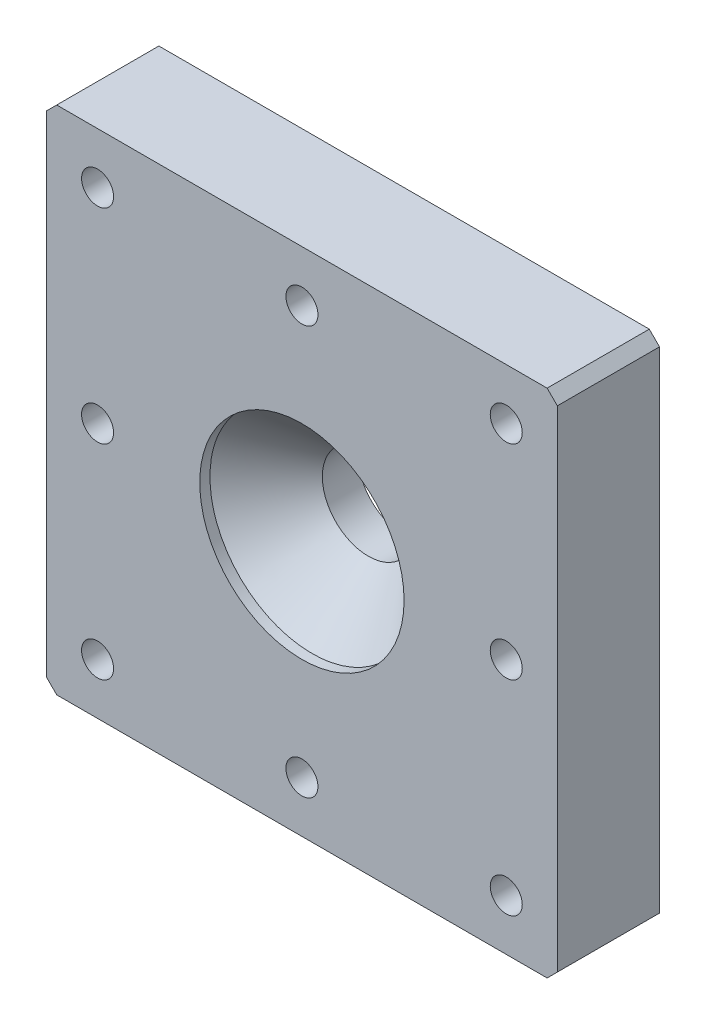
ISO-10303-21;
HEADER;
FILE_DESCRIPTION(('STEP AP214'),'2;1');
FILE_NAME('part.step','',(''),(''),'','','');
FILE_SCHEMA(('AUTOMOTIVE_DESIGN { 1 0 10303 214 1 1 1 1 }'));
ENDSEC;
DATA;
#1=APPLICATION_CONTEXT('core data for automotive mechanical design processes');
#2=APPLICATION_PROTOCOL_DEFINITION('international standard','automotive_design',2000,#1);
#3=PRODUCT_CONTEXT('',#1,'mechanical');
#4=PRODUCT('Part','Part','',(#3));
#5=PRODUCT_RELATED_PRODUCT_CATEGORY('part','',(#4));
#6=PRODUCT_DEFINITION_FORMATION('','',#4);
#7=PRODUCT_DEFINITION_CONTEXT('part definition',#1,'design');
#8=PRODUCT_DEFINITION('design','',#6,#7);
#9=PRODUCT_DEFINITION_SHAPE('','',#8);
#10=(LENGTH_UNIT() NAMED_UNIT(*) SI_UNIT(.MILLI.,.METRE.));
#11=(NAMED_UNIT(*) PLANE_ANGLE_UNIT() SI_UNIT($,.RADIAN.));
#12=(NAMED_UNIT(*) SI_UNIT($,.STERADIAN.) SOLID_ANGLE_UNIT());
#13=UNCERTAINTY_MEASURE_WITH_UNIT(LENGTH_MEASURE(1.E-05),#10,'distance_accuracy_value','');
#14=(GEOMETRIC_REPRESENTATION_CONTEXT(3) GLOBAL_UNCERTAINTY_ASSIGNED_CONTEXT((#13)) GLOBAL_UNIT_ASSIGNED_CONTEXT((#10,
#11,#12)) REPRESENTATION_CONTEXT('',''));
#15=CARTESIAN_POINT('',(0.,0.,0.));
#16=DIRECTION('',(0.,0.,1.));
#17=DIRECTION('',(1.,0.,0.));
#18=AXIS2_PLACEMENT_3D('',#15,#16,#17);
#19=CARTESIAN_POINT('',(0.,0.,5.));
#20=DIRECTION('',(0.,0.,1.));
#21=DIRECTION('',(1.,0.,0.));
#22=AXIS2_PLACEMENT_3D('',#19,#20,#21);
#23=PLANE('',#22);
#24=CARTESIAN_POINT('',(0.,0.,5.));
#25=DIRECTION('',(0.,0.,-1.));
#26=DIRECTION('',(-1.,0.,0.));
#27=AXIS2_PLACEMENT_3D('',#24,#25,#26);
#28=CIRCLE('',#27,5.);
#29=CARTESIAN_POINT('',(5.,0.,5.));
#30=VERTEX_POINT('',#29);
#31=EDGE_CURVE('E23',#30,#30,#28,.T.);
#32=ORIENTED_EDGE('',*,*,#31,.T.);
#33=EDGE_LOOP('',(#32));
#34=FACE_BOUND('',#33,.T.);
#35=CARTESIAN_POINT('',(10.,0.,5.));
#36=DIRECTION('',(0.,0.,-1.));
#37=DIRECTION('',(1.,0.,0.));
#38=AXIS2_PLACEMENT_3D('',#35,#36,#37);
#39=CIRCLE('',#38,0.7835);
#40=CARTESIAN_POINT('',(10.7835,0.,5.));
#41=VERTEX_POINT('',#40);
#42=EDGE_CURVE('E165',#41,#41,#39,.T.);
#43=ORIENTED_EDGE('',*,*,#42,.T.);
#44=EDGE_LOOP('',(#43));
#45=FACE_BOUND('',#44,.T.);
#46=CARTESIAN_POINT('',(10.,-10.,5.));
#47=DIRECTION('',(0.,0.,-1.));
#48=DIRECTION('',(1.,0.,0.));
#49=AXIS2_PLACEMENT_3D('',#46,#47,#48);
#50=CIRCLE('',#49,0.7835);
#51=CARTESIAN_POINT('',(10.7835,-10.,5.));
#52=VERTEX_POINT('',#51);
#53=EDGE_CURVE('E170',#52,#52,#50,.T.);
#54=ORIENTED_EDGE('',*,*,#53,.T.);
#55=EDGE_LOOP('',(#54));
#56=FACE_BOUND('',#55,.T.);
#57=CARTESIAN_POINT('',(0.,-10.,5.));
#58=DIRECTION('',(0.,0.,-1.));
#59=DIRECTION('',(1.,0.,0.));
#60=AXIS2_PLACEMENT_3D('',#57,#58,#59);
#61=CIRCLE('',#60,0.7835);
#62=CARTESIAN_POINT('',(0.7835,-10.,5.));
#63=VERTEX_POINT('',#62);
#64=EDGE_CURVE('E178',#63,#63,#61,.T.);
#65=ORIENTED_EDGE('',*,*,#64,.T.);
#66=EDGE_LOOP('',(#65));
#67=FACE_BOUND('',#66,.T.);
#68=CARTESIAN_POINT('',(-10.,-10.,5.));
#69=DIRECTION('',(0.,0.,-1.));
#70=DIRECTION('',(1.,0.,0.));
#71=AXIS2_PLACEMENT_3D('',#68,#69,#70);
#72=CIRCLE('',#71,0.7835);
#73=CARTESIAN_POINT('',(-9.2165,-10.,5.));
#74=VERTEX_POINT('',#73);
#75=EDGE_CURVE('E207',#74,#74,#72,.T.);
#76=ORIENTED_EDGE('',*,*,#75,.T.);
#77=EDGE_LOOP('',(#76));
#78=FACE_BOUND('',#77,.T.);
#79=CARTESIAN_POINT('',(-10.,0.,5.));
#80=DIRECTION('',(0.,0.,-1.));
#81=DIRECTION('',(1.,0.,0.));
#82=AXIS2_PLACEMENT_3D('',#79,#80,#81);
#83=CIRCLE('',#82,0.7835);
#84=CARTESIAN_POINT('',(-9.2165,0.,5.));
#85=VERTEX_POINT('',#84);
#86=EDGE_CURVE('E212',#85,#85,#83,.T.);
#87=ORIENTED_EDGE('',*,*,#86,.T.);
#88=EDGE_LOOP('',(#87));
#89=FACE_BOUND('',#88,.T.);
#90=CARTESIAN_POINT('',(10.,10.,5.));
#91=DIRECTION('',(0.,0.,-1.));
#92=DIRECTION('',(1.,0.,0.));
#93=AXIS2_PLACEMENT_3D('',#90,#91,#92);
#94=CIRCLE('',#93,0.7835);
#95=CARTESIAN_POINT('',(10.7835,10.,5.));
#96=VERTEX_POINT('',#95);
#97=EDGE_CURVE('E216',#96,#96,#94,.T.);
#98=ORIENTED_EDGE('',*,*,#97,.T.);
#99=EDGE_LOOP('',(#98));
#100=FACE_BOUND('',#99,.T.);
#101=CARTESIAN_POINT('',(0.,10.,5.));
#102=DIRECTION('',(0.,0.,-1.));
#103=DIRECTION('',(1.,0.,0.));
#104=AXIS2_PLACEMENT_3D('',#101,#102,#103);
#105=CIRCLE('',#104,0.7835);
#106=CARTESIAN_POINT('',(0.7835,10.,5.));
#107=VERTEX_POINT('',#106);
#108=EDGE_CURVE('E220',#107,#107,#105,.T.);
#109=ORIENTED_EDGE('',*,*,#108,.T.);
#110=EDGE_LOOP('',(#109));
#111=FACE_BOUND('',#110,.T.);
#112=CARTESIAN_POINT('',(-10.,10.,5.));
#113=DIRECTION('',(0.,0.,-1.));
#114=DIRECTION('',(1.,0.,0.));
#115=AXIS2_PLACEMENT_3D('',#112,#113,#114);
#116=CIRCLE('',#115,0.7835);
#117=CARTESIAN_POINT('',(-9.2165,10.,5.));
#118=VERTEX_POINT('',#117);
#119=EDGE_CURVE('E226',#118,#118,#116,.T.);
#120=ORIENTED_EDGE('',*,*,#119,.T.);
#121=EDGE_LOOP('',(#120));
#122=FACE_BOUND('',#121,.T.);
#123=DIRECTION('',(-0.707106781186549,-0.707106781186546,0.));
#124=VECTOR('',#123,1.);
#125=CARTESIAN_POINT('',(12.5,-12.,5.));
#126=LINE('',#125,#124);
#127=CARTESIAN_POINT('',(12.5,-12.,5.));
#128=VERTEX_POINT('',#127);
#129=CARTESIAN_POINT('',(12.,-12.5,5.));
#130=VERTEX_POINT('',#129);
#131=EDGE_CURVE('E425',#128,#130,#126,.T.);
#132=ORIENTED_EDGE('',*,*,#131,.F.);
#133=DIRECTION('',(0.,-1.,0.));
#134=VECTOR('',#133,1.);
#135=CARTESIAN_POINT('',(12.5,12.,5.));
#136=LINE('',#135,#134);
#137=CARTESIAN_POINT('',(12.5,12.,5.));
#138=VERTEX_POINT('',#137);
#139=EDGE_CURVE('E385',#138,#128,#136,.T.);
#140=ORIENTED_EDGE('',*,*,#139,.F.);
#141=DIRECTION('',(0.707106781186546,-0.707106781186549,0.));
#142=VECTOR('',#141,1.);
#143=CARTESIAN_POINT('',(12.,12.5,5.));
#144=LINE('',#143,#142);
#145=CARTESIAN_POINT('',(12.,12.5,5.));
#146=VERTEX_POINT('',#145);
#147=EDGE_CURVE('E244',#146,#138,#144,.T.);
#148=ORIENTED_EDGE('',*,*,#147,.F.);
#149=DIRECTION('',(1.,0.,0.));
#150=VECTOR('',#149,1.);
#151=CARTESIAN_POINT('',(-12.,12.5,5.));
#152=LINE('',#151,#150);
#153=CARTESIAN_POINT('',(-12.,12.5,5.));
#154=VERTEX_POINT('',#153);
#155=EDGE_CURVE('E258',#154,#146,#152,.T.);
#156=ORIENTED_EDGE('',*,*,#155,.F.);
#157=DIRECTION('',(0.707106781186549,0.707106781186546,0.));
#158=VECTOR('',#157,1.);
#159=CARTESIAN_POINT('',(-12.5,12.,5.));
#160=LINE('',#159,#158);
#161=CARTESIAN_POINT('',(-12.5,12.,5.));
#162=VERTEX_POINT('',#161);
#163=EDGE_CURVE('E278',#162,#154,#160,.T.);
#164=ORIENTED_EDGE('',*,*,#163,.F.);
#165=DIRECTION('',(0.,1.,0.));
#166=VECTOR('',#165,1.);
#167=CARTESIAN_POINT('',(-12.5,-12.,5.));
#168=LINE('',#167,#166);
#169=CARTESIAN_POINT('',(-12.5,-12.,5.));
#170=VERTEX_POINT('',#169);
#171=EDGE_CURVE('E230',#170,#162,#168,.T.);
#172=ORIENTED_EDGE('',*,*,#171,.F.);
#173=DIRECTION('',(-0.707106781186546,0.707106781186549,0.));
#174=VECTOR('',#173,1.);
#175=CARTESIAN_POINT('',(-12.,-12.5,5.));
#176=LINE('',#175,#174);
#177=CARTESIAN_POINT('',(-12.,-12.5,5.));
#178=VERTEX_POINT('',#177);
#179=EDGE_CURVE('E238',#178,#170,#176,.T.);
#180=ORIENTED_EDGE('',*,*,#179,.F.);
#181=DIRECTION('',(-1.,0.,0.));
#182=VECTOR('',#181,1.);
#183=CARTESIAN_POINT('',(12.,-12.5,5.));
#184=LINE('',#183,#182);
#185=EDGE_CURVE('E10',#130,#178,#184,.T.);
#186=ORIENTED_EDGE('',*,*,#185,.F.);
#187=EDGE_LOOP('',(#132,#140,#148,#156,#164,#172,#180,#186));
#188=FACE_BOUND('',#187,.T.);
#189=ADVANCED_FACE('F15',(#34,#45,#56,#67,#78,#89,#100,#111,#122,#188),#23,.T.);
#190=CARTESIAN_POINT('',(12.5,-12.5,0.));
#191=DIRECTION('',(0.,-1.,0.));
#192=DIRECTION('',(0.,0.,-1.));
#193=AXIS2_PLACEMENT_3D('',#190,#191,#192);
#194=PLANE('',#193);
#195=DIRECTION('',(0.,0.,-1.));
#196=VECTOR('',#195,1.);
#197=CARTESIAN_POINT('',(12.,-12.5,5.));
#198=LINE('',#197,#196);
#199=CARTESIAN_POINT('',(12.,-12.5,0.));
#200=VERTEX_POINT('',#199);
#201=EDGE_CURVE('E420',#130,#200,#198,.T.);
#202=ORIENTED_EDGE('',*,*,#201,.F.);
#203=ORIENTED_EDGE('',*,*,#185,.T.);
#204=DIRECTION('',(0.,0.,1.));
#205=VECTOR('',#204,1.);
#206=CARTESIAN_POINT('',(-12.,-12.5,0.));
#207=LINE('',#206,#205);
#208=CARTESIAN_POINT('',(-12.,-12.5,0.));
#209=VERTEX_POINT('',#208);
#210=EDGE_CURVE('E234',#209,#178,#207,.T.);
#211=ORIENTED_EDGE('',*,*,#210,.F.);
#212=DIRECTION('',(-1.,0.,0.));
#213=VECTOR('',#212,1.);
#214=CARTESIAN_POINT('',(12.,-12.5,0.));
#215=LINE('',#214,#213);
#216=EDGE_CURVE('E374',#200,#209,#215,.T.);
#217=ORIENTED_EDGE('',*,*,#216,.F.);
#218=EDGE_LOOP('',(#202,#203,#211,#217));
#219=FACE_BOUND('',#218,.T.);
#220=ADVANCED_FACE('F476',(#219),#194,.T.);
#221=CARTESIAN_POINT('',(0.,0.,5.));
#222=DIRECTION('',(0.,0.,-1.));
#223=DIRECTION('',(-1.,0.,0.));
#224=AXIS2_PLACEMENT_3D('',#221,#222,#223);
#225=CYLINDRICAL_SURFACE('',#224,5.);
#226=ORIENTED_EDGE('',*,*,#31,.F.);
#227=EDGE_LOOP('',(#226));
#228=FACE_BOUND('',#227,.T.);
#229=CARTESIAN_POINT('',(0.,0.,4.5));
#230=DIRECTION('',(0.,0.,1.));
#231=DIRECTION('',(-1.,0.,0.));
#232=AXIS2_PLACEMENT_3D('',#229,#230,#231);
#233=CIRCLE('',#232,5.);
#234=CARTESIAN_POINT('',(5.,0.,4.5));
#235=VERTEX_POINT('',#234);
#236=EDGE_CURVE('E169',#235,#235,#233,.T.);
#237=ORIENTED_EDGE('',*,*,#236,.F.);
#238=EDGE_LOOP('',(#237));
#239=FACE_BOUND('',#238,.T.);
#240=ADVANCED_FACE('F478',(#228,#239),#225,.F.);
#241=CARTESIAN_POINT('',(-2.25,0.,1.75));
#242=CARTESIAN_POINT('',(-2.25,-2.25,1.75));
#243=CARTESIAN_POINT('',(0.,-2.25,1.75));
#244=CARTESIAN_POINT('',(2.25,-2.25,1.75));
#245=CARTESIAN_POINT('',(2.25,0.,1.75));
#246=CARTESIAN_POINT('',(2.25,2.25,1.75));
#247=CARTESIAN_POINT('',(0.,2.25,1.75));
#248=CARTESIAN_POINT('',(-2.25,2.25,1.75));
#249=CARTESIAN_POINT('',(-2.25,0.,1.75));
#250=CARTESIAN_POINT('',(-2.25,0.,0.));
#251=CARTESIAN_POINT('',(-2.25,-2.25,0.));
#252=CARTESIAN_POINT('',(0.,-2.25,0.));
#253=CARTESIAN_POINT('',(2.25,-2.25,0.));
#254=CARTESIAN_POINT('',(2.25,0.,0.));
#255=CARTESIAN_POINT('',(2.25,2.25,0.));
#256=CARTESIAN_POINT('',(0.,2.25,0.));
#257=CARTESIAN_POINT('',(-2.25,2.25,0.));
#258=CARTESIAN_POINT('',(-2.25,0.,0.));
#259=(BOUNDED_SURFACE() B_SPLINE_SURFACE(1,2,((#241,#242,#243,#244,#245,#246,#247,#248,#249),
(#250,#251,#252,#253,#254,#255,#256,#257,#258)),.UNSPECIFIED.,.F.,.T.,
.F.) B_SPLINE_SURFACE_WITH_KNOTS((2,2),(3,2,2,2,3),(-14.6476187300952,-13.8698409523174),(0.,
3.53429173528852,7.06858347057704,10.6028752058655,14.1371669411541),
.UNSPECIFIED.) GEOMETRIC_REPRESENTATION_ITEM() RATIONAL_B_SPLINE_SURFACE(((1.,0.707106781186548,
1.,0.707106781186548,1.,0.707106781186548,1.,0.707106781186548,1.),(1.,0.707106781186548,1.,
0.707106781186548,1.,0.707106781186548,1.,0.707106781186548,1.))) REPRESENTATION_ITEM('') SURFACE());
#260=CARTESIAN_POINT('',(0.,0.,1.75));
#261=DIRECTION('',(0.,0.,1.));
#262=DIRECTION('',(1.,0.,0.));
#263=AXIS2_PLACEMENT_3D('',#260,#261,#262);
#264=CIRCLE('',#263,2.25);
#265=CARTESIAN_POINT('',(2.25,0.,1.75));
#266=VERTEX_POINT('',#265);
#267=EDGE_CURVE('E42',#266,#266,#264,.T.);
#268=CARTESIAN_POINT('',(0.,0.,0.));
#269=DIRECTION('',(0.,0.,1.));
#270=DIRECTION('',(1.,0.,0.));
#271=AXIS2_PLACEMENT_3D('',#268,#269,#270);
#272=CIRCLE('',#271,2.25);
#273=CARTESIAN_POINT('',(-2.25,0.,0.));
#274=VERTEX_POINT('',#273);
#275=EDGE_CURVE('E285',#274,#274,#272,.T.);
#276=ORIENTED_EDGE('',*,*,#267,.T.);
#277=EDGE_LOOP('',(#276));
#278=FACE_BOUND('',#277,.T.);
#279=ORIENTED_EDGE('',*,*,#275,.F.);
#280=EDGE_LOOP('',(#279));
#281=FACE_BOUND('',#280,.T.);
#282=ADVANCED_FACE('F484',(#278,#281),#259,.F.);
#283=CARTESIAN_POINT('',(-5.,0.,4.5));
#284=CARTESIAN_POINT('',(-5.,-5.,4.5));
#285=CARTESIAN_POINT('',(0.,-5.,4.5));
#286=CARTESIAN_POINT('',(5.,-5.,4.5));
#287=CARTESIAN_POINT('',(5.,0.,4.5));
#288=CARTESIAN_POINT('',(5.,5.,4.5));
#289=CARTESIAN_POINT('',(0.,5.,4.5));
#290=CARTESIAN_POINT('',(-5.,5.,4.5));
#291=CARTESIAN_POINT('',(-5.,0.,4.5));
#292=CARTESIAN_POINT('',(-2.25,0.,1.75));
#293=CARTESIAN_POINT('',(-2.25,-2.25,1.75));
#294=CARTESIAN_POINT('',(0.,-2.25,1.75));
#295=CARTESIAN_POINT('',(2.25,-2.25,1.75));
#296=CARTESIAN_POINT('',(2.25,0.,1.75));
#297=CARTESIAN_POINT('',(2.25,2.25,1.75));
#298=CARTESIAN_POINT('',(0.,2.25,1.75));
#299=CARTESIAN_POINT('',(-2.25,2.25,1.75));
#300=CARTESIAN_POINT('',(-2.25,0.,1.75));
#301=(BOUNDED_SURFACE() B_SPLINE_SURFACE(1,2,((#283,#284,#285,#286,#287,#288,#289,#290,#291),
(#292,#293,#294,#295,#296,#297,#298,#299,#300)),.UNSPECIFIED.,.F.,.T.,
.F.) B_SPLINE_SURFACE_WITH_KNOTS((2,2),(3,2,2,2,3),(-0.536425834003588,0.536425834003587),(0.,
5.6941366846315,11.388273369263,17.0824100538945,22.776546738526),
.UNSPECIFIED.) GEOMETRIC_REPRESENTATION_ITEM() RATIONAL_B_SPLINE_SURFACE(((1.,0.707106781186548,
1.,0.707106781186548,1.,0.707106781186548,1.,0.707106781186548,1.),(1.,0.707106781186548,1.,
0.707106781186548,1.,0.707106781186548,1.,0.707106781186548,1.))) REPRESENTATION_ITEM('') SURFACE());
#302=ORIENTED_EDGE('',*,*,#267,.F.);
#303=EDGE_LOOP('',(#302));
#304=FACE_BOUND('',#303,.T.);
#305=ORIENTED_EDGE('',*,*,#236,.T.);
#306=EDGE_LOOP('',(#305));
#307=FACE_BOUND('',#306,.T.);
#308=ADVANCED_FACE('F492',(#304,#307),#301,.F.);
#309=CARTESIAN_POINT('',(9.2165,0.,5.));
#310=CARTESIAN_POINT('',(9.2165,-0.783499999999999,5.));
#311=CARTESIAN_POINT('',(10.,-0.7835,5.));
#312=CARTESIAN_POINT('',(10.7835,-0.783499999999999,5.));
#313=CARTESIAN_POINT('',(10.7835,0.,5.));
#314=CARTESIAN_POINT('',(10.7835,0.783499999999999,5.));
#315=CARTESIAN_POINT('',(10.,0.7835,5.));
#316=CARTESIAN_POINT('',(9.2165,0.783499999999999,5.));
#317=CARTESIAN_POINT('',(9.2165,0.,5.));
#318=CARTESIAN_POINT('',(9.2165,0.,0.));
#319=CARTESIAN_POINT('',(9.2165,-0.783499999999999,0.));
#320=CARTESIAN_POINT('',(10.,-0.7835,0.));
#321=CARTESIAN_POINT('',(10.7835,-0.783499999999999,0.));
#322=CARTESIAN_POINT('',(10.7835,0.,0.));
#323=CARTESIAN_POINT('',(10.7835,0.783499999999999,0.));
#324=CARTESIAN_POINT('',(10.,0.7835,0.));
#325=CARTESIAN_POINT('',(9.2165,0.783499999999999,0.));
#326=CARTESIAN_POINT('',(9.2165,0.,0.));
#327=(BOUNDED_SURFACE() B_SPLINE_SURFACE(1,2,((#309,#310,#311,#312,#313,#314,#315,#316,#317),
(#318,#319,#320,#321,#322,#323,#324,#325,#326)),.UNSPECIFIED.,.F.,.T.,
.F.) B_SPLINE_SURFACE_WITH_KNOTS((2,2),(3,2,2,2,3),(-45.5738891419454,-39.1922682102288),(0.,
1.2307189220438,2.4614378440876,3.69215676613141,4.92287568817521),
.UNSPECIFIED.) GEOMETRIC_REPRESENTATION_ITEM() RATIONAL_B_SPLINE_SURFACE(((1.,0.707106781186548,
1.,0.707106781186548,1.,0.707106781186548,1.,0.707106781186548,1.),(1.,0.707106781186548,1.,
0.707106781186548,1.,0.707106781186548,1.,0.707106781186548,1.))) REPRESENTATION_ITEM('') SURFACE());
#328=CARTESIAN_POINT('',(10.,0.,0.));
#329=DIRECTION('',(0.,0.,1.));
#330=DIRECTION('',(1.,0.,0.));
#331=AXIS2_PLACEMENT_3D('',#328,#329,#330);
#332=CIRCLE('',#331,0.7835);
#333=CARTESIAN_POINT('',(9.2165,0.,0.));
#334=VERTEX_POINT('',#333);
#335=EDGE_CURVE('E291',#334,#334,#332,.T.);
#336=ORIENTED_EDGE('',*,*,#42,.F.);
#337=EDGE_LOOP('',(#336));
#338=FACE_BOUND('',#337,.T.);
#339=ORIENTED_EDGE('',*,*,#335,.F.);
#340=EDGE_LOOP('',(#339));
#341=FACE_BOUND('',#340,.T.);
#342=ADVANCED_FACE('F515',(#338,#341),#327,.F.);
#343=CARTESIAN_POINT('',(9.2165,-10.,5.));
#344=CARTESIAN_POINT('',(9.2165,-10.7835,5.));
#345=CARTESIAN_POINT('',(10.,-10.7835,5.));
#346=CARTESIAN_POINT('',(10.7835,-10.7835,5.));
#347=CARTESIAN_POINT('',(10.7835,-10.,5.));
#348=CARTESIAN_POINT('',(10.7835,-9.2165,5.));
#349=CARTESIAN_POINT('',(10.,-9.2165,5.));
#350=CARTESIAN_POINT('',(9.2165,-9.2165,5.));
#351=CARTESIAN_POINT('',(9.2165,-10.,5.));
#352=CARTESIAN_POINT('',(9.2165,-10.,0.));
#353=CARTESIAN_POINT('',(9.2165,-10.7835,0.));
#354=CARTESIAN_POINT('',(10.,-10.7835,0.));
#355=CARTESIAN_POINT('',(10.7835,-10.7835,0.));
#356=CARTESIAN_POINT('',(10.7835,-10.,0.));
#357=CARTESIAN_POINT('',(10.7835,-9.2165,0.));
#358=CARTESIAN_POINT('',(10.,-9.2165,0.));
#359=CARTESIAN_POINT('',(9.2165,-9.2165,0.));
#360=CARTESIAN_POINT('',(9.2165,-10.,0.));
#361=(BOUNDED_SURFACE() B_SPLINE_SURFACE(1,2,((#343,#344,#345,#346,#347,#348,#349,#350,#351),
(#352,#353,#354,#355,#356,#357,#358,#359,#360)),.UNSPECIFIED.,.F.,.T.,
.F.) B_SPLINE_SURFACE_WITH_KNOTS((2,2),(3,2,2,2,3),(-45.5738891419454,-39.1922682102288),(0.,
1.2307189220438,2.4614378440876,3.69215676613141,4.92287568817521),
.UNSPECIFIED.) GEOMETRIC_REPRESENTATION_ITEM() RATIONAL_B_SPLINE_SURFACE(((1.,0.707106781186548,
1.,0.707106781186548,1.,0.707106781186548,1.,0.707106781186548,1.),(1.,0.707106781186548,1.,
0.707106781186548,1.,0.707106781186548,1.,0.707106781186548,1.))) REPRESENTATION_ITEM('') SURFACE());
#362=CARTESIAN_POINT('',(10.,-10.,0.));
#363=DIRECTION('',(0.,0.,1.));
#364=DIRECTION('',(1.,0.,0.));
#365=AXIS2_PLACEMENT_3D('',#362,#363,#364);
#366=CIRCLE('',#365,0.7835);
#367=CARTESIAN_POINT('',(9.2165,-10.,0.));
#368=VERTEX_POINT('',#367);
#369=EDGE_CURVE('E297',#368,#368,#366,.T.);
#370=ORIENTED_EDGE('',*,*,#53,.F.);
#371=EDGE_LOOP('',(#370));
#372=FACE_BOUND('',#371,.T.);
#373=ORIENTED_EDGE('',*,*,#369,.F.);
#374=EDGE_LOOP('',(#373));
#375=FACE_BOUND('',#374,.T.);
#376=ADVANCED_FACE('F504',(#372,#375),#361,.F.);
#377=CARTESIAN_POINT('',(-0.7835,-10.,5.));
#378=CARTESIAN_POINT('',(-0.783499999999999,-10.7835,5.));
#379=CARTESIAN_POINT('',(0.,-10.7835,5.));
#380=CARTESIAN_POINT('',(0.783499999999999,-10.7835,5.));
#381=CARTESIAN_POINT('',(0.7835,-10.,5.));
#382=CARTESIAN_POINT('',(0.783499999999999,-9.2165,5.));
#383=CARTESIAN_POINT('',(0.,-9.2165,5.));
#384=CARTESIAN_POINT('',(-0.783499999999999,-9.2165,5.));
#385=CARTESIAN_POINT('',(-0.7835,-10.,5.));
#386=CARTESIAN_POINT('',(-0.7835,-10.,0.));
#387=CARTESIAN_POINT('',(-0.783499999999999,-10.7835,0.));
#388=CARTESIAN_POINT('',(0.,-10.7835,0.));
#389=CARTESIAN_POINT('',(0.783499999999999,-10.7835,0.));
#390=CARTESIAN_POINT('',(0.7835,-10.,0.));
#391=CARTESIAN_POINT('',(0.783499999999999,-9.2165,0.));
#392=CARTESIAN_POINT('',(0.,-9.2165,0.));
#393=CARTESIAN_POINT('',(-0.783499999999999,-9.2165,0.));
#394=CARTESIAN_POINT('',(-0.7835,-10.,0.));
#395=(BOUNDED_SURFACE() B_SPLINE_SURFACE(1,2,((#377,#378,#379,#380,#381,#382,#383,#384,#385),
(#386,#387,#388,#389,#390,#391,#392,#393,#394)),.UNSPECIFIED.,.F.,.T.,
.F.) B_SPLINE_SURFACE_WITH_KNOTS((2,2),(3,2,2,2,3),(-45.5738891419454,-39.1922682102288),(0.,
1.2307189220438,2.4614378440876,3.69215676613141,4.92287568817521),
.UNSPECIFIED.) GEOMETRIC_REPRESENTATION_ITEM() RATIONAL_B_SPLINE_SURFACE(((1.,0.707106781186548,
1.,0.707106781186548,1.,0.707106781186548,1.,0.707106781186548,1.),(1.,0.707106781186548,1.,
0.707106781186548,1.,0.707106781186548,1.,0.707106781186548,1.))) REPRESENTATION_ITEM('') SURFACE());
#396=CARTESIAN_POINT('',(0.,-10.,0.));
#397=DIRECTION('',(0.,0.,1.));
#398=DIRECTION('',(1.,0.,0.));
#399=AXIS2_PLACEMENT_3D('',#396,#397,#398);
#400=CIRCLE('',#399,0.7835);
#401=CARTESIAN_POINT('',(-0.7835,-10.,0.));
#402=VERTEX_POINT('',#401);
#403=EDGE_CURVE('E303',#402,#402,#400,.T.);
#404=ORIENTED_EDGE('',*,*,#64,.F.);
#405=EDGE_LOOP('',(#404));
#406=FACE_BOUND('',#405,.T.);
#407=ORIENTED_EDGE('',*,*,#403,.F.);
#408=EDGE_LOOP('',(#407));
#409=FACE_BOUND('',#408,.T.);
#410=ADVANCED_FACE('F493',(#406,#409),#395,.F.);
#411=CARTESIAN_POINT('',(-10.7835,-10.,5.));
#412=CARTESIAN_POINT('',(-10.7835,-10.7835,5.));
#413=CARTESIAN_POINT('',(-10.,-10.7835,5.));
#414=CARTESIAN_POINT('',(-9.2165,-10.7835,5.));
#415=CARTESIAN_POINT('',(-9.2165,-10.,5.));
#416=CARTESIAN_POINT('',(-9.2165,-9.2165,5.));
#417=CARTESIAN_POINT('',(-10.,-9.2165,5.));
#418=CARTESIAN_POINT('',(-10.7835,-9.2165,5.));
#419=CARTESIAN_POINT('',(-10.7835,-10.,5.));
#420=CARTESIAN_POINT('',(-10.7835,-10.,0.));
#421=CARTESIAN_POINT('',(-10.7835,-10.7835,0.));
#422=CARTESIAN_POINT('',(-10.,-10.7835,0.));
#423=CARTESIAN_POINT('',(-9.2165,-10.7835,0.));
#424=CARTESIAN_POINT('',(-9.2165,-10.,0.));
#425=CARTESIAN_POINT('',(-9.2165,-9.2165,0.));
#426=CARTESIAN_POINT('',(-10.,-9.2165,0.));
#427=CARTESIAN_POINT('',(-10.7835,-9.2165,0.));
#428=CARTESIAN_POINT('',(-10.7835,-10.,0.));
#429=(BOUNDED_SURFACE() B_SPLINE_SURFACE(1,2,((#411,#412,#413,#414,#415,#416,#417,#418,#419),
(#420,#421,#422,#423,#424,#425,#426,#427,#428)),.UNSPECIFIED.,.F.,.T.,
.F.) B_SPLINE_SURFACE_WITH_KNOTS((2,2),(3,2,2,2,3),(-45.5738891419454,-39.1922682102288),(0.,
1.2307189220438,2.4614378440876,3.69215676613141,4.92287568817521),
.UNSPECIFIED.) GEOMETRIC_REPRESENTATION_ITEM() RATIONAL_B_SPLINE_SURFACE(((1.,0.707106781186548,
1.,0.707106781186548,1.,0.707106781186548,1.,0.707106781186548,1.),(1.,0.707106781186548,1.,
0.707106781186548,1.,0.707106781186548,1.,0.707106781186548,1.))) REPRESENTATION_ITEM('') SURFACE());
#430=CARTESIAN_POINT('',(-10.,-10.,0.));
#431=DIRECTION('',(0.,0.,1.));
#432=DIRECTION('',(1.,0.,0.));
#433=AXIS2_PLACEMENT_3D('',#430,#431,#432);
#434=CIRCLE('',#433,0.7835);
#435=CARTESIAN_POINT('',(-10.7835,-10.,0.));
#436=VERTEX_POINT('',#435);
#437=EDGE_CURVE('E313',#436,#436,#434,.T.);
#438=ORIENTED_EDGE('',*,*,#75,.F.);
#439=EDGE_LOOP('',(#438));
#440=FACE_BOUND('',#439,.T.);
#441=ORIENTED_EDGE('',*,*,#437,.F.);
#442=EDGE_LOOP('',(#441));
#443=FACE_BOUND('',#442,.T.);
#444=ADVANCED_FACE('F503',(#440,#443),#429,.F.);
#445=CARTESIAN_POINT('',(-10.7835,0.,5.));
#446=CARTESIAN_POINT('',(-10.7835,-0.783499999999999,5.));
#447=CARTESIAN_POINT('',(-10.,-0.7835,5.));
#448=CARTESIAN_POINT('',(-9.2165,-0.783499999999999,5.));
#449=CARTESIAN_POINT('',(-9.2165,0.,5.));
#450=CARTESIAN_POINT('',(-9.2165,0.783499999999999,5.));
#451=CARTESIAN_POINT('',(-10.,0.7835,5.));
#452=CARTESIAN_POINT('',(-10.7835,0.783499999999999,5.));
#453=CARTESIAN_POINT('',(-10.7835,0.,5.));
#454=CARTESIAN_POINT('',(-10.7835,0.,0.));
#455=CARTESIAN_POINT('',(-10.7835,-0.783499999999999,0.));
#456=CARTESIAN_POINT('',(-10.,-0.7835,0.));
#457=CARTESIAN_POINT('',(-9.2165,-0.783499999999999,0.));
#458=CARTESIAN_POINT('',(-9.2165,0.,0.));
#459=CARTESIAN_POINT('',(-9.2165,0.783499999999999,0.));
#460=CARTESIAN_POINT('',(-10.,0.7835,0.));
#461=CARTESIAN_POINT('',(-10.7835,0.783499999999999,0.));
#462=CARTESIAN_POINT('',(-10.7835,0.,0.));
#463=(BOUNDED_SURFACE() B_SPLINE_SURFACE(1,2,((#445,#446,#447,#448,#449,#450,#451,#452,#453),
(#454,#455,#456,#457,#458,#459,#460,#461,#462)),.UNSPECIFIED.,.F.,.T.,
.F.) B_SPLINE_SURFACE_WITH_KNOTS((2,2),(3,2,2,2,3),(-45.5738891419454,-39.1922682102288),(0.,
1.2307189220438,2.4614378440876,3.69215676613141,4.92287568817521),
.UNSPECIFIED.) GEOMETRIC_REPRESENTATION_ITEM() RATIONAL_B_SPLINE_SURFACE(((1.,0.707106781186548,
1.,0.707106781186548,1.,0.707106781186548,1.,0.707106781186548,1.),(1.,0.707106781186548,1.,
0.707106781186548,1.,0.707106781186548,1.,0.707106781186548,1.))) REPRESENTATION_ITEM('') SURFACE());
#464=CARTESIAN_POINT('',(-10.,0.,0.));
#465=DIRECTION('',(0.,0.,1.));
#466=DIRECTION('',(1.,0.,0.));
#467=AXIS2_PLACEMENT_3D('',#464,#465,#466);
#468=CIRCLE('',#467,0.7835);
#469=CARTESIAN_POINT('',(-10.7835,0.,0.));
#470=VERTEX_POINT('',#469);
#471=EDGE_CURVE('E320',#470,#470,#468,.T.);
#472=ORIENTED_EDGE('',*,*,#86,.F.);
#473=EDGE_LOOP('',(#472));
#474=FACE_BOUND('',#473,.T.);
#475=ORIENTED_EDGE('',*,*,#471,.F.);
#476=EDGE_LOOP('',(#475));
#477=FACE_BOUND('',#476,.T.);
#478=ADVANCED_FACE('F536',(#474,#477),#463,.F.);
#479=CARTESIAN_POINT('',(9.2165,10.,5.));
#480=CARTESIAN_POINT('',(9.2165,9.2165,5.));
#481=CARTESIAN_POINT('',(10.,9.2165,5.));
#482=CARTESIAN_POINT('',(10.7835,9.2165,5.));
#483=CARTESIAN_POINT('',(10.7835,10.,5.));
#484=CARTESIAN_POINT('',(10.7835,10.7835,5.));
#485=CARTESIAN_POINT('',(10.,10.7835,5.));
#486=CARTESIAN_POINT('',(9.2165,10.7835,5.));
#487=CARTESIAN_POINT('',(9.2165,10.,5.));
#488=CARTESIAN_POINT('',(9.2165,10.,0.));
#489=CARTESIAN_POINT('',(9.2165,9.2165,0.));
#490=CARTESIAN_POINT('',(10.,9.2165,0.));
#491=CARTESIAN_POINT('',(10.7835,9.2165,0.));
#492=CARTESIAN_POINT('',(10.7835,10.,0.));
#493=CARTESIAN_POINT('',(10.7835,10.7835,0.));
#494=CARTESIAN_POINT('',(10.,10.7835,0.));
#495=CARTESIAN_POINT('',(9.2165,10.7835,0.));
#496=CARTESIAN_POINT('',(9.2165,10.,0.));
#497=(BOUNDED_SURFACE() B_SPLINE_SURFACE(1,2,((#479,#480,#481,#482,#483,#484,#485,#486,#487),
(#488,#489,#490,#491,#492,#493,#494,#495,#496)),.UNSPECIFIED.,.F.,.T.,
.F.) B_SPLINE_SURFACE_WITH_KNOTS((2,2),(3,2,2,2,3),(-45.5738891419454,-39.1922682102288),(0.,
1.2307189220438,2.4614378440876,3.69215676613141,4.92287568817521),
.UNSPECIFIED.) GEOMETRIC_REPRESENTATION_ITEM() RATIONAL_B_SPLINE_SURFACE(((1.,0.707106781186548,
1.,0.707106781186548,1.,0.707106781186548,1.,0.707106781186548,1.),(1.,0.707106781186548,1.,
0.707106781186548,1.,0.707106781186548,1.,0.707106781186548,1.))) REPRESENTATION_ITEM('') SURFACE());
#498=CARTESIAN_POINT('',(10.,10.,0.));
#499=DIRECTION('',(0.,0.,1.));
#500=DIRECTION('',(1.,0.,0.));
#501=AXIS2_PLACEMENT_3D('',#498,#499,#500);
#502=CIRCLE('',#501,0.7835);
#503=CARTESIAN_POINT('',(9.2165,10.,0.));
#504=VERTEX_POINT('',#503);
#505=EDGE_CURVE('E326',#504,#504,#502,.T.);
#506=ORIENTED_EDGE('',*,*,#97,.F.);
#507=EDGE_LOOP('',(#506));
#508=FACE_BOUND('',#507,.T.);
#509=ORIENTED_EDGE('',*,*,#505,.F.);
#510=EDGE_LOOP('',(#509));
#511=FACE_BOUND('',#510,.T.);
#512=ADVANCED_FACE('F547',(#508,#511),#497,.F.);
#513=CARTESIAN_POINT('',(-0.7835,10.,5.));
#514=CARTESIAN_POINT('',(-0.783499999999999,9.2165,5.));
#515=CARTESIAN_POINT('',(0.,9.2165,5.));
#516=CARTESIAN_POINT('',(0.783499999999999,9.2165,5.));
#517=CARTESIAN_POINT('',(0.7835,10.,5.));
#518=CARTESIAN_POINT('',(0.783499999999999,10.7835,5.));
#519=CARTESIAN_POINT('',(0.,10.7835,5.));
#520=CARTESIAN_POINT('',(-0.783499999999999,10.7835,5.));
#521=CARTESIAN_POINT('',(-0.7835,10.,5.));
#522=CARTESIAN_POINT('',(-0.7835,10.,0.));
#523=CARTESIAN_POINT('',(-0.783499999999999,9.2165,0.));
#524=CARTESIAN_POINT('',(0.,9.2165,0.));
#525=CARTESIAN_POINT('',(0.783499999999999,9.2165,0.));
#526=CARTESIAN_POINT('',(0.7835,10.,0.));
#527=CARTESIAN_POINT('',(0.783499999999999,10.7835,0.));
#528=CARTESIAN_POINT('',(0.,10.7835,0.));
#529=CARTESIAN_POINT('',(-0.783499999999999,10.7835,0.));
#530=CARTESIAN_POINT('',(-0.7835,10.,0.));
#531=(BOUNDED_SURFACE() B_SPLINE_SURFACE(1,2,((#513,#514,#515,#516,#517,#518,#519,#520,#521),
(#522,#523,#524,#525,#526,#527,#528,#529,#530)),.UNSPECIFIED.,.F.,.T.,
.F.) B_SPLINE_SURFACE_WITH_KNOTS((2,2),(3,2,2,2,3),(-45.5738891419454,-39.1922682102288),(0.,
1.2307189220438,2.4614378440876,3.69215676613141,4.92287568817521),
.UNSPECIFIED.) GEOMETRIC_REPRESENTATION_ITEM() RATIONAL_B_SPLINE_SURFACE(((1.,0.707106781186548,
1.,0.707106781186548,1.,0.707106781186548,1.,0.707106781186548,1.),(1.,0.707106781186548,1.,
0.707106781186548,1.,0.707106781186548,1.,0.707106781186548,1.))) REPRESENTATION_ITEM('') SURFACE());
#532=CARTESIAN_POINT('',(0.,10.,0.));
#533=DIRECTION('',(0.,0.,1.));
#534=DIRECTION('',(1.,0.,0.));
#535=AXIS2_PLACEMENT_3D('',#532,#533,#534);
#536=CIRCLE('',#535,0.7835);
#537=CARTESIAN_POINT('',(-0.7835,10.,0.));
#538=VERTEX_POINT('',#537);
#539=EDGE_CURVE('E336',#538,#538,#536,.T.);
#540=ORIENTED_EDGE('',*,*,#108,.F.);
#541=EDGE_LOOP('',(#540));
#542=FACE_BOUND('',#541,.T.);
#543=ORIENTED_EDGE('',*,*,#539,.F.);
#544=EDGE_LOOP('',(#543));
#545=FACE_BOUND('',#544,.T.);
#546=ADVANCED_FACE('F558',(#542,#545),#531,.F.);
#547=CARTESIAN_POINT('',(-10.7835,10.,5.));
#548=CARTESIAN_POINT('',(-10.7835,9.2165,5.));
#549=CARTESIAN_POINT('',(-10.,9.2165,5.));
#550=CARTESIAN_POINT('',(-9.2165,9.2165,5.));
#551=CARTESIAN_POINT('',(-9.2165,10.,5.));
#552=CARTESIAN_POINT('',(-9.2165,10.7835,5.));
#553=CARTESIAN_POINT('',(-10.,10.7835,5.));
#554=CARTESIAN_POINT('',(-10.7835,10.7835,5.));
#555=CARTESIAN_POINT('',(-10.7835,10.,5.));
#556=CARTESIAN_POINT('',(-10.7835,10.,0.));
#557=CARTESIAN_POINT('',(-10.7835,9.2165,0.));
#558=CARTESIAN_POINT('',(-10.,9.2165,0.));
#559=CARTESIAN_POINT('',(-9.2165,9.2165,0.));
#560=CARTESIAN_POINT('',(-9.2165,10.,0.));
#561=CARTESIAN_POINT('',(-9.2165,10.7835,0.));
#562=CARTESIAN_POINT('',(-10.,10.7835,0.));
#563=CARTESIAN_POINT('',(-10.7835,10.7835,0.));
#564=CARTESIAN_POINT('',(-10.7835,10.,0.));
#565=(BOUNDED_SURFACE() B_SPLINE_SURFACE(1,2,((#547,#548,#549,#550,#551,#552,#553,#554,#555),
(#556,#557,#558,#559,#560,#561,#562,#563,#564)),.UNSPECIFIED.,.F.,.T.,
.F.) B_SPLINE_SURFACE_WITH_KNOTS((2,2),(3,2,2,2,3),(-45.5738891419454,-39.1922682102288),(0.,
1.2307189220438,2.4614378440876,3.69215676613141,4.92287568817521),
.UNSPECIFIED.) GEOMETRIC_REPRESENTATION_ITEM() RATIONAL_B_SPLINE_SURFACE(((1.,0.707106781186548,
1.,0.707106781186548,1.,0.707106781186548,1.,0.707106781186548,1.),(1.,0.707106781186548,1.,
0.707106781186548,1.,0.707106781186548,1.,0.707106781186548,1.))) REPRESENTATION_ITEM('') SURFACE());
#566=CARTESIAN_POINT('',(-10.,10.,0.));
#567=DIRECTION('',(0.,0.,1.));
#568=DIRECTION('',(1.,0.,0.));
#569=AXIS2_PLACEMENT_3D('',#566,#567,#568);
#570=CIRCLE('',#569,0.7835);
#571=CARTESIAN_POINT('',(-10.7835,10.,0.));
#572=VERTEX_POINT('',#571);
#573=EDGE_CURVE('E340',#572,#572,#570,.T.);
#574=ORIENTED_EDGE('',*,*,#119,.F.);
#575=EDGE_LOOP('',(#574));
#576=FACE_BOUND('',#575,.T.);
#577=ORIENTED_EDGE('',*,*,#573,.F.);
#578=EDGE_LOOP('',(#577));
#579=FACE_BOUND('',#578,.T.);
#580=ADVANCED_FACE('F560',(#576,#579),#565,.F.);
#581=CARTESIAN_POINT('',(-12.5,-12.5,0.));
#582=DIRECTION('',(-1.,0.,0.));
#583=DIRECTION('',(0.,0.,1.));
#584=AXIS2_PLACEMENT_3D('',#581,#582,#583);
#585=PLANE('',#584);
#586=DIRECTION('',(0.,0.,1.));
#587=VECTOR('',#586,1.);
#588=CARTESIAN_POINT('',(-12.5,12.,0.));
#589=LINE('',#588,#587);
#590=CARTESIAN_POINT('',(-12.5,12.,0.));
#591=VERTEX_POINT('',#590);
#592=EDGE_CURVE('E265',#591,#162,#589,.T.);
#593=ORIENTED_EDGE('',*,*,#592,.F.);
#594=DIRECTION('',(0.,1.,0.));
#595=VECTOR('',#594,1.);
#596=CARTESIAN_POINT('',(-12.5,-12.,0.));
#597=LINE('',#596,#595);
#598=CARTESIAN_POINT('',(-12.5,-12.,0.));
#599=VERTEX_POINT('',#598);
#600=EDGE_CURVE('E360',#599,#591,#597,.T.);
#601=ORIENTED_EDGE('',*,*,#600,.F.);
#602=DIRECTION('',(0.,0.,-1.));
#603=VECTOR('',#602,1.);
#604=CARTESIAN_POINT('',(-12.5,-12.,5.));
#605=LINE('',#604,#603);
#606=EDGE_CURVE('E243',#170,#599,#605,.T.);
#607=ORIENTED_EDGE('',*,*,#606,.F.);
#608=ORIENTED_EDGE('',*,*,#171,.T.);
#609=EDGE_LOOP('',(#593,#601,#607,#608));
#610=FACE_BOUND('',#609,.T.);
#611=ADVANCED_FACE('F570',(#610),#585,.T.);
#612=CARTESIAN_POINT('',(-12.25,-12.25,0.));
#613=DIRECTION('',(-0.707106781186549,-0.707106781186546,0.));
#614=DIRECTION('',(-0.707106781186546,0.707106781186549,0.));
#615=AXIS2_PLACEMENT_3D('',#612,#613,#614);
#616=PLANE('',#615);
#617=ORIENTED_EDGE('',*,*,#179,.T.);
#618=ORIENTED_EDGE('',*,*,#606,.T.);
#619=DIRECTION('',(0.707106781186546,-0.707106781186549,0.));
#620=VECTOR('',#619,1.);
#621=CARTESIAN_POINT('',(-12.5,-12.,0.));
#622=LINE('',#621,#620);
#623=EDGE_CURVE('E367',#599,#209,#622,.T.);
#624=ORIENTED_EDGE('',*,*,#623,.T.);
#625=ORIENTED_EDGE('',*,*,#210,.T.);
#626=EDGE_LOOP('',(#617,#618,#624,#625));
#627=FACE_BOUND('',#626,.T.);
#628=ADVANCED_FACE('F579',(#627),#616,.T.);
#629=CARTESIAN_POINT('',(12.25,12.25,0.));
#630=DIRECTION('',(0.707106781186549,0.707106781186546,0.));
#631=DIRECTION('',(0.,0.,-1.));
#632=AXIS2_PLACEMENT_3D('',#629,#630,#631);
#633=PLANE('',#632);
#634=ORIENTED_EDGE('',*,*,#147,.T.);
#635=DIRECTION('',(0.,0.,-1.));
#636=VECTOR('',#635,1.);
#637=CARTESIAN_POINT('',(12.5,12.,5.));
#638=LINE('',#637,#636);
#639=CARTESIAN_POINT('',(12.5,12.,0.));
#640=VERTEX_POINT('',#639);
#641=EDGE_CURVE('E389',#138,#640,#638,.T.);
#642=ORIENTED_EDGE('',*,*,#641,.T.);
#643=DIRECTION('',(-0.707106781186546,0.707106781186549,0.));
#644=VECTOR('',#643,1.);
#645=CARTESIAN_POINT('',(12.5,12.,0.));
#646=LINE('',#645,#644);
#647=CARTESIAN_POINT('',(12.,12.5,0.));
#648=VERTEX_POINT('',#647);
#649=EDGE_CURVE('E344',#640,#648,#646,.T.);
#650=ORIENTED_EDGE('',*,*,#649,.T.);
#651=DIRECTION('',(0.,0.,1.));
#652=VECTOR('',#651,1.);
#653=CARTESIAN_POINT('',(12.,12.5,0.));
#654=LINE('',#653,#652);
#655=EDGE_CURVE('E251',#648,#146,#654,.T.);
#656=ORIENTED_EDGE('',*,*,#655,.T.);
#657=EDGE_LOOP('',(#634,#642,#650,#656));
#658=FACE_BOUND('',#657,.T.);
#659=ADVANCED_FACE('F592',(#658),#633,.T.);
#660=CARTESIAN_POINT('',(-12.5,12.5,0.));
#661=DIRECTION('',(0.,1.,0.));
#662=DIRECTION('',(1.,0.,0.));
#663=AXIS2_PLACEMENT_3D('',#660,#661,#662);
#664=PLANE('',#663);
#665=DIRECTION('',(0.,0.,-1.));
#666=VECTOR('',#665,1.);
#667=CARTESIAN_POINT('',(-12.,12.5,5.));
#668=LINE('',#667,#666);
#669=CARTESIAN_POINT('',(-12.,12.5,0.));
#670=VERTEX_POINT('',#669);
#671=EDGE_CURVE('E272',#154,#670,#668,.T.);
#672=ORIENTED_EDGE('',*,*,#671,.F.);
#673=ORIENTED_EDGE('',*,*,#155,.T.);
#674=ORIENTED_EDGE('',*,*,#655,.F.);
#675=DIRECTION('',(1.,0.,0.));
#676=VECTOR('',#675,1.);
#677=CARTESIAN_POINT('',(-12.,12.5,0.));
#678=LINE('',#677,#676);
#679=EDGE_CURVE('E348',#670,#648,#678,.T.);
#680=ORIENTED_EDGE('',*,*,#679,.F.);
#681=EDGE_LOOP('',(#672,#673,#674,#680));
#682=FACE_BOUND('',#681,.T.);
#683=ADVANCED_FACE('F596',(#682),#664,.T.);
#684=CARTESIAN_POINT('',(-12.25,12.25,0.));
#685=DIRECTION('',(-0.707106781186546,0.707106781186549,0.));
#686=DIRECTION('',(0.,0.,1.));
#687=AXIS2_PLACEMENT_3D('',#684,#685,#686);
#688=PLANE('',#687);
#689=ORIENTED_EDGE('',*,*,#163,.T.);
#690=ORIENTED_EDGE('',*,*,#671,.T.);
#691=DIRECTION('',(-0.707106781186549,-0.707106781186546,0.));
#692=VECTOR('',#691,1.);
#693=CARTESIAN_POINT('',(-12.,12.5,0.));
#694=LINE('',#693,#692);
#695=EDGE_CURVE('E353',#670,#591,#694,.T.);
#696=ORIENTED_EDGE('',*,*,#695,.T.);
#697=ORIENTED_EDGE('',*,*,#592,.T.);
#698=EDGE_LOOP('',(#689,#690,#696,#697));
#699=FACE_BOUND('',#698,.T.);
#700=ADVANCED_FACE('F600',(#699),#688,.T.);
#701=CARTESIAN_POINT('',(0.,0.,0.));
#702=DIRECTION('',(0.,0.,1.));
#703=DIRECTION('',(1.,0.,0.));
#704=AXIS2_PLACEMENT_3D('',#701,#702,#703);
#705=PLANE('',#704);
#706=ORIENTED_EDGE('',*,*,#275,.T.);
#707=EDGE_LOOP('',(#706));
#708=FACE_BOUND('',#707,.T.);
#709=ORIENTED_EDGE('',*,*,#335,.T.);
#710=EDGE_LOOP('',(#709));
#711=FACE_BOUND('',#710,.T.);
#712=ORIENTED_EDGE('',*,*,#369,.T.);
#713=EDGE_LOOP('',(#712));
#714=FACE_BOUND('',#713,.T.);
#715=ORIENTED_EDGE('',*,*,#403,.T.);
#716=EDGE_LOOP('',(#715));
#717=FACE_BOUND('',#716,.T.);
#718=ORIENTED_EDGE('',*,*,#437,.T.);
#719=EDGE_LOOP('',(#718));
#720=FACE_BOUND('',#719,.T.);
#721=ORIENTED_EDGE('',*,*,#471,.T.);
#722=EDGE_LOOP('',(#721));
#723=FACE_BOUND('',#722,.T.);
#724=ORIENTED_EDGE('',*,*,#505,.T.);
#725=EDGE_LOOP('',(#724));
#726=FACE_BOUND('',#725,.T.);
#727=ORIENTED_EDGE('',*,*,#539,.T.);
#728=EDGE_LOOP('',(#727));
#729=FACE_BOUND('',#728,.T.);
#730=ORIENTED_EDGE('',*,*,#573,.T.);
#731=EDGE_LOOP('',(#730));
#732=FACE_BOUND('',#731,.T.);
#733=DIRECTION('',(0.707106781186549,0.707106781186546,0.));
#734=VECTOR('',#733,1.);
#735=CARTESIAN_POINT('',(12.,-12.5,0.));
#736=LINE('',#735,#734);
#737=CARTESIAN_POINT('',(12.5,-12.,0.));
#738=VERTEX_POINT('',#737);
#739=EDGE_CURVE('E416',#200,#738,#736,.T.);
#740=ORIENTED_EDGE('',*,*,#739,.F.);
#741=ORIENTED_EDGE('',*,*,#216,.T.);
#742=ORIENTED_EDGE('',*,*,#623,.F.);
#743=ORIENTED_EDGE('',*,*,#600,.T.);
#744=ORIENTED_EDGE('',*,*,#695,.F.);
#745=ORIENTED_EDGE('',*,*,#679,.T.);
#746=ORIENTED_EDGE('',*,*,#649,.F.);
#747=DIRECTION('',(0.,-1.,0.));
#748=VECTOR('',#747,1.);
#749=CARTESIAN_POINT('',(12.5,12.,0.));
#750=LINE('',#749,#748);
#751=EDGE_CURVE('E394',#640,#738,#750,.T.);
#752=ORIENTED_EDGE('',*,*,#751,.T.);
#753=EDGE_LOOP('',(#740,#741,#742,#743,#744,#745,#746,#752));
#754=FACE_BOUND('',#753,.T.);
#755=ADVANCED_FACE('F456',(#708,#711,#714,#717,#720,#723,#726,#729,#732,#754),#705,.F.);
#756=CARTESIAN_POINT('',(12.5,12.5,0.));
#757=DIRECTION('',(1.,0.,0.));
#758=DIRECTION('',(0.,1.,0.));
#759=AXIS2_PLACEMENT_3D('',#756,#757,#758);
#760=PLANE('',#759);
#761=DIRECTION('',(0.,0.,1.));
#762=VECTOR('',#761,1.);
#763=CARTESIAN_POINT('',(12.5,-12.,0.));
#764=LINE('',#763,#762);
#765=EDGE_CURVE('E409',#738,#128,#764,.T.);
#766=ORIENTED_EDGE('',*,*,#765,.F.);
#767=ORIENTED_EDGE('',*,*,#751,.F.);
#768=ORIENTED_EDGE('',*,*,#641,.F.);
#769=ORIENTED_EDGE('',*,*,#139,.T.);
#770=EDGE_LOOP('',(#766,#767,#768,#769));
#771=FACE_BOUND('',#770,.T.);
#772=ADVANCED_FACE('F473',(#771),#760,.T.);
#773=CARTESIAN_POINT('',(12.25,-12.25,0.));
#774=DIRECTION('',(0.707106781186546,-0.707106781186549,0.));
#775=DIRECTION('',(0.,0.,-1.));
#776=AXIS2_PLACEMENT_3D('',#773,#774,#775);
#777=PLANE('',#776);
#778=ORIENTED_EDGE('',*,*,#131,.T.);
#779=ORIENTED_EDGE('',*,*,#201,.T.);
#780=ORIENTED_EDGE('',*,*,#739,.T.);
#781=ORIENTED_EDGE('',*,*,#765,.T.);
#782=EDGE_LOOP('',(#778,#779,#780,#781));
#783=FACE_BOUND('',#782,.T.);
#784=ADVANCED_FACE('F450',(#783),#777,.T.);
#785=CLOSED_SHELL('',(#189,#220,#240,#282,#308,#342,#376,#410,#444,#478,#512,#546,#580,#611,
#628,#659,#683,#700,#755,#772,#784));
#786=MANIFOLD_SOLID_BREP('B1',#785);
#787=ADVANCED_BREP_SHAPE_REPRESENTATION('',(#18,#786),#14);
#788=SHAPE_DEFINITION_REPRESENTATION(#9,#787);
ENDSEC;
END-ISO-10303-21;
